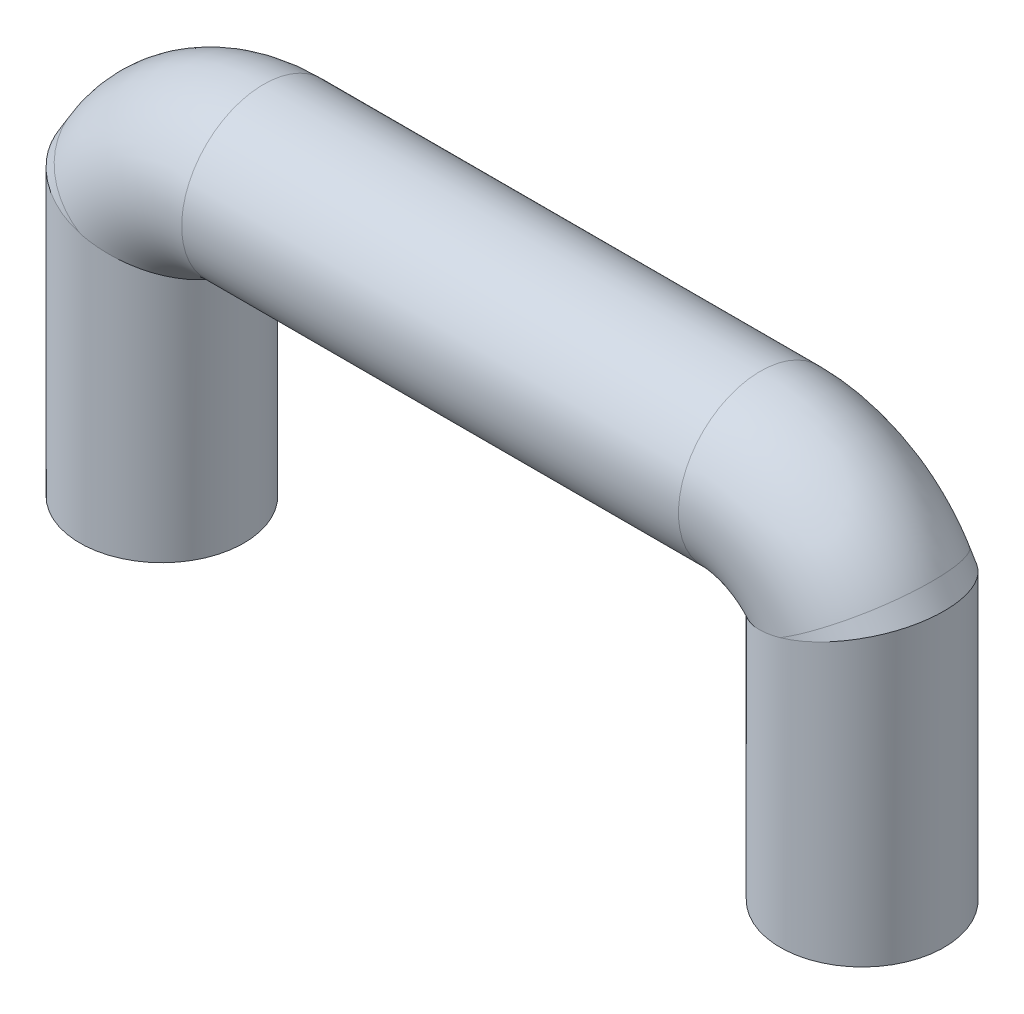
ISO-10303-21;
HEADER;
FILE_DESCRIPTION(('STEP AP214'),'2;1');
FILE_NAME('part.step','',(''),(''),'','','');
FILE_SCHEMA(('AUTOMOTIVE_DESIGN { 1 0 10303 214 1 1 1 1 }'));
ENDSEC;
DATA;
#1=APPLICATION_CONTEXT('core data for automotive mechanical design processes');
#2=APPLICATION_PROTOCOL_DEFINITION('international standard','automotive_design',2000,#1);
#3=PRODUCT_CONTEXT('',#1,'mechanical');
#4=PRODUCT('Part','Part','',(#3));
#5=PRODUCT_RELATED_PRODUCT_CATEGORY('part','',(#4));
#6=PRODUCT_DEFINITION_FORMATION('','',#4);
#7=PRODUCT_DEFINITION_CONTEXT('part definition',#1,'design');
#8=PRODUCT_DEFINITION('design','',#6,#7);
#9=PRODUCT_DEFINITION_SHAPE('','',#8);
#10=(LENGTH_UNIT() NAMED_UNIT(*) SI_UNIT(.MILLI.,.METRE.));
#11=(NAMED_UNIT(*) PLANE_ANGLE_UNIT() SI_UNIT($,.RADIAN.));
#12=(NAMED_UNIT(*) SI_UNIT($,.STERADIAN.) SOLID_ANGLE_UNIT());
#13=UNCERTAINTY_MEASURE_WITH_UNIT(LENGTH_MEASURE(1.E-05),#10,'distance_accuracy_value','');
#14=(GEOMETRIC_REPRESENTATION_CONTEXT(3) GLOBAL_UNCERTAINTY_ASSIGNED_CONTEXT((#13)) GLOBAL_UNIT_ASSIGNED_CONTEXT((#10,
#11,#12)) REPRESENTATION_CONTEXT('',''));
#15=CARTESIAN_POINT('',(0.,0.,0.));
#16=DIRECTION('',(0.,0.,1.));
#17=DIRECTION('',(1.,0.,0.));
#18=AXIS2_PLACEMENT_3D('',#15,#16,#17);
#19=CARTESIAN_POINT('',(-17.6186026200873,-16.369519650655,0.));
#20=DIRECTION('',(0.,1.,0.));
#21=DIRECTION('',(0.,0.,-1.));
#22=AXIS2_PLACEMENT_3D('',#19,#20,#21);
#23=PLANE('',#22);
#24=CARTESIAN_POINT('',(-17.6186026200873,-16.369519650655,0.));
#25=DIRECTION('',(0.,1.,0.));
#26=DIRECTION('',(0.,0.,1.));
#27=AXIS2_PLACEMENT_3D('',#24,#25,#26);
#28=CIRCLE('',#27,2.82085553);
#29=CARTESIAN_POINT('',(-17.6186026200873,-16.369519650655,2.82085553));
#30=VERTEX_POINT('',#29);
#31=EDGE_CURVE('E205',#30,#30,#28,.T.);
#32=ORIENTED_EDGE('',*,*,#31,.T.);
#33=EDGE_LOOP('',(#32));
#34=FACE_BOUND('',#33,.T.);
#35=CARTESIAN_POINT('',(-17.6186026200873,-16.369519650655,0.));
#36=DIRECTION('',(0.,1.,0.));
#37=DIRECTION('',(0.,0.,-1.));
#38=AXIS2_PLACEMENT_3D('',#35,#36,#37);
#39=CIRCLE('',#38,4.125);
#40=CARTESIAN_POINT('',(-17.6186026200873,-16.369519650655,-4.125));
#41=VERTEX_POINT('',#40);
#42=EDGE_CURVE('E50',#41,#41,#39,.T.);
#43=ORIENTED_EDGE('',*,*,#42,.F.);
#44=EDGE_LOOP('',(#43));
#45=FACE_BOUND('',#44,.T.);
#46=ADVANCED_FACE('F47',(#34,#45),#23,.F.);
#47=CARTESIAN_POINT('',(17.6186026200873,-16.369519650655,0.));
#48=DIRECTION('',(0.,-1.,0.));
#49=DIRECTION('',(0.,0.,-1.));
#50=AXIS2_PLACEMENT_3D('',#47,#48,#49);
#51=PLANE('',#50);
#52=CARTESIAN_POINT('',(17.6186026200873,-16.369519650655,0.));
#53=DIRECTION('',(0.,-1.,0.));
#54=DIRECTION('',(0.,0.,-1.));
#55=AXIS2_PLACEMENT_3D('',#52,#53,#54);
#56=CIRCLE('',#55,2.82085552878336);
#57=CARTESIAN_POINT('',(17.6186026200873,-16.369519650655,-2.82085552878336));
#58=VERTEX_POINT('',#57);
#59=EDGE_CURVE('E199',#58,#58,#56,.T.);
#60=ORIENTED_EDGE('',*,*,#59,.F.);
#61=EDGE_LOOP('',(#60));
#62=FACE_BOUND('',#61,.T.);
#63=CARTESIAN_POINT('',(17.6186026200873,-16.369519650655,0.));
#64=DIRECTION('',(0.,-1.,0.));
#65=DIRECTION('',(0.,0.,-1.));
#66=AXIS2_PLACEMENT_3D('',#63,#64,#65);
#67=CIRCLE('',#66,4.125);
#68=CARTESIAN_POINT('',(17.6186026200873,-16.369519650655,-4.125));
#69=VERTEX_POINT('',#68);
#70=EDGE_CURVE('E172',#69,#69,#67,.T.);
#71=ORIENTED_EDGE('',*,*,#70,.T.);
#72=EDGE_LOOP('',(#71));
#73=FACE_BOUND('',#72,.T.);
#74=ADVANCED_FACE('F187',(#62,#73),#51,.T.);
#75=CARTESIAN_POINT('',(-17.6186026200873,-0.214422563276417,0.));
#76=DIRECTION('',(0.,-1.,0.));
#77=DIRECTION('',(1.,0.,0.));
#78=AXIS2_PLACEMENT_3D('',#75,#76,#77);
#79=CYLINDRICAL_SURFACE('',#78,4.125);
#80=CARTESIAN_POINT('',(-17.6186026200873,-2.86951965065504,-4.125));
#81=CARTESIAN_POINT('',(-17.6128968235518,-2.87112613427577,-4.12500001518511));
#82=CARTESIAN_POINT('',(-17.6071912129329,-2.87273380517715,-4.12498817536425));
#83=CARTESIAN_POINT('',(-17.4794190029486,-2.90876407261816,-4.12445766424607));
#84=CARTESIAN_POINT('',(-17.3574623015286,-2.94372410383834,-4.11852700793072));
#85=CARTESIAN_POINT('',(-17.1147496630716,-3.01453967239473,-4.09592886641109));
#86=CARTESIAN_POINT('',(-16.9939946928557,-3.05039586026166,-4.07925335016539));
#87=CARTESIAN_POINT('',(-16.7543334326414,-3.12290187060962,-4.0352857600741));
#88=CARTESIAN_POINT('',(-16.6354322466009,-3.15955338399803,-4.00796842594452));
#89=CARTESIAN_POINT('',(-16.4006428621797,-3.23336648891211,-3.942976559663));
#90=CARTESIAN_POINT('',(-16.2847558712435,-3.2705282760085,-3.90529794479571));
#91=CARTESIAN_POINT('',(-15.9455369494259,-3.38159461080433,-3.77812481046318));
#92=CARTESIAN_POINT('',(-15.7276646239738,-3.45598034738844,-3.67393776836076));
#93=CARTESIAN_POINT('',(-15.3133917273406,-3.60380403675916,-3.42921888424413));
#94=CARTESIAN_POINT('',(-15.1169773685411,-3.67724257108469,-3.28871057785453));
#95=CARTESIAN_POINT('',(-14.7493901569286,-3.82117327471932,-2.97360578390559));
#96=CARTESIAN_POINT('',(-14.5784329563172,-3.89163700604125,-2.79874429441132));
#97=CARTESIAN_POINT('',(-14.2688405463201,-4.02530623529539,-2.41961486625036));
#98=CARTESIAN_POINT('',(-14.1302161712934,-4.0885092966705,-2.21533710750902));
#99=CARTESIAN_POINT('',(-13.9523927352985,-4.17300466652817,-1.89444835598539));
#100=CARTESIAN_POINT('',(-13.8987585135937,-4.19911679025437,-1.7868748486565));
#101=CARTESIAN_POINT('',(-13.800843155311,-4.24769693229892,-1.56678470925341));
#102=CARTESIAN_POINT('',(-13.7565570522542,-4.2701668841541,-1.45427074053258));
#103=CARTESIAN_POINT('',(-13.6778880634209,-4.31072511122053,-1.22517592607922));
#104=CARTESIAN_POINT('',(-13.6434968108956,-4.32881708623008,-1.10859861025656));
#105=CARTESIAN_POINT('',(-13.5850350602011,-4.35993934465224,-0.87222214631851));
#106=CARTESIAN_POINT('',(-13.5609631545917,-4.37297031830439,-0.752423439933808));
#107=CARTESIAN_POINT('',(-13.5253569262034,-4.39238062203634,-0.522612090847803));
#108=CARTESIAN_POINT('',(-13.5128208420264,-4.39928889846613,-0.412798478190806));
#109=CARTESIAN_POINT('',(-13.4966066153212,-4.40824156380489,-0.192323622628078));
#110=CARTESIAN_POINT('',(-13.4929277917471,-4.41028632667532,-0.0816624455490589));
#111=CARTESIAN_POINT('',(-13.4944805147506,-4.40942575167135,0.13954641259957));
#112=CARTESIAN_POINT('',(-13.4997096366412,-4.40652176081657,0.250094116360942));
#113=CARTESIAN_POINT('',(-13.5189976433964,-4.39588874160226,0.470177554052248));
#114=CARTESIAN_POINT('',(-13.5330563606574,-4.38815980483,0.579713307151014));
#115=CARTESIAN_POINT('',(-13.5683861725797,-4.36896030952618,0.788474645258816));
#116=CARTESIAN_POINT('',(-13.5890133065344,-4.35782644382733,0.887840970312597));
#117=CARTESIAN_POINT('',(-13.637394554097,-4.33206093188619,1.08437234287644));
#118=CARTESIAN_POINT('',(-13.6651510823335,-4.3174281007082,1.1815366324302));
#119=CARTESIAN_POINT('',(-13.7587332233055,-4.26887551261055,1.46885715104322));
#120=CARTESIAN_POINT('',(-13.8348933003713,-4.23028912675516,1.65496840128586));
#121=CARTESIAN_POINT('',(-14.0184058331836,-4.14107284385081,2.0247909894453));
#122=CARTESIAN_POINT('',(-14.1275519144452,-4.08979437182865,2.20744528436455));
#123=CARTESIAN_POINT('',(-14.3713486421856,-3.98043050725435,2.55257047140177));
#124=CARTESIAN_POINT('',(-14.5060061310424,-3.92234329013579,2.71503592929804));
#125=CARTESIAN_POINT('',(-14.8124809038865,-3.79598712031622,3.03228779705573));
#126=CARTESIAN_POINT('',(-14.9866882946644,-3.72728410552489,3.18459734480883));
#127=CARTESIAN_POINT('',(-15.3575633820103,-3.5877310373574,3.45780474003969));
#128=CARTESIAN_POINT('',(-15.5542442216624,-3.51687974558674,3.57868406952528));
#129=CARTESIAN_POINT('',(-15.9674437418028,-3.37428076588316,3.78728082663452));
#130=CARTESIAN_POINT('',(-16.1841726707593,-3.30253255134338,3.87458167219847));
#131=CARTESIAN_POINT('',(-16.6293900054862,-3.16078431931182,4.0113841503303));
#132=CARTESIAN_POINT('',(-16.8578577308705,-3.09078152966477,4.06094997809607));
#133=CARTESIAN_POINT('',(-17.2588831125475,-2.97207601384589,4.11284527223674));
#134=CARTESIAN_POINT('',(-17.430083358314,-2.92267615270245,4.12425277156103));
#135=CARTESIAN_POINT('',(-17.6071912281267,-2.8727338006982,4.12498817711629));
#136=CARTESIAN_POINT('',(-17.612896837409,-2.87112613018375,4.12500001678629));
#137=CARTESIAN_POINT('',(-17.6186026200873,-2.86951965065504,4.125));
#138=B_SPLINE_CURVE_WITH_KNOTS('',3,(#80,#81,#82,#83,#84,#85,#86,#87,#88,#89,#90,#91,#92,#93,
#94,#95,#96,#97,#98,#99,#100,#101,#102,#103,#104,#105,#106,#107,#108,#109,#110,#111,#112,#113,
#114,#115,#116,#117,#118,#119,#120,#121,#122,#123,#124,#125,#126,#127,#128,#129,#130,#131,#132,
#133,#134,#135,#136,#137),.UNSPECIFIED.,.F.,.F.,(4,2,2,2,2,2,2,2,2,2,2,2,2,2,2,2,2,2,2,2,2,2,2,
2,2,2,2,2,4),(0.,0.0177833256369088,0.398258975931993,0.779019335917142,1.16068906139759,
1.54250939443769,2.29677632962771,3.05055573121066,3.81039588957597,4.57049029704123,
4.93909706522456,5.30750750392988,5.67560550558406,6.04365328692247,6.37543130893956,
6.70718381931752,7.03884604317264,7.37050197159538,7.67643474571521,7.9824712720326,
8.5941591990063,9.24817048381255,9.90235742901795,10.6233244467794,11.3447152847951,
12.0747874667891,12.8036148499089,13.3378655779384,13.3556489035753),.UNSPECIFIED.);
#139=CARTESIAN_POINT('',(-17.6186026200873,-2.86951965065504,-4.125));
#140=VERTEX_POINT('',#139);
#141=CARTESIAN_POINT('',(-17.6186026200873,-2.86951965065504,4.125));
#142=VERTEX_POINT('',#141);
#143=EDGE_CURVE('E74',#140,#142,#138,.T.);
#144=ORIENTED_EDGE('',*,*,#143,.T.);
#145=CARTESIAN_POINT('',(-17.6186026200873,-2.86951965065504,0.));
#146=DIRECTION('',(-0.271016201839277,-0.962574785842956,0.));
#147=DIRECTION('',(-0.962574785842956,0.271016201839277,0.));
#148=AXIS2_PLACEMENT_3D('',#145,#146,#147);
#149=ELLIPSE('',#148,4.28538131339854,4.125);
#150=EDGE_CURVE('E170',#140,#142,#149,.F.);
#151=ORIENTED_EDGE('',*,*,#150,.F.);
#152=EDGE_LOOP('',(#144,#151));
#153=FACE_BOUND('',#152,.T.);
#154=ORIENTED_EDGE('',*,*,#42,.T.);
#155=EDGE_LOOP('',(#154));
#156=FACE_BOUND('',#155,.T.);
#157=ADVANCED_FACE('F184',(#153,#156),#79,.T.);
#158=CARTESIAN_POINT('',(19.0038908296943,-5.13458413532877,0.));
#159=DIRECTION('',(-0.52174672489083,0.853100436681223,0.));
#160=DIRECTION('',(-0.853100436681223,-0.52174672489083,0.));
#161=AXIS2_PLACEMENT_3D('',#158,#159,#160);
#162=CYLINDRICAL_SURFACE('',#161,4.125);
#163=CARTESIAN_POINT('',(17.6186026200873,-2.86951965065502,0.));
#164=DIRECTION('',(0.52174672489083,-0.853100436681223,0.));
#165=DIRECTION('',(0.,0.,-1.));
#166=AXIS2_PLACEMENT_3D('',#163,#164,#165);
#167=CIRCLE('',#166,4.125);
#168=CARTESIAN_POINT('',(17.6186026200873,-2.86951965065502,-4.125));
#169=VERTEX_POINT('',#168);
#170=CARTESIAN_POINT('',(17.6186026200873,-2.86951965065502,4.125));
#171=VERTEX_POINT('',#170);
#172=EDGE_CURVE('E156',#169,#171,#167,.T.);
#173=ORIENTED_EDGE('',*,*,#172,.T.);
#174=CARTESIAN_POINT('',(17.6186026200873,-2.86951965065502,0.));
#175=DIRECTION('',(-0.271016201839279,0.962574785842955,0.));
#176=DIRECTION('',(0.962574785842955,0.271016201839279,0.));
#177=AXIS2_PLACEMENT_3D('',#174,#175,#176);
#178=ELLIPSE('',#177,4.28538131339854,4.125);
#179=EDGE_CURVE('E57',#169,#171,#178,.F.);
#180=ORIENTED_EDGE('',*,*,#179,.F.);
#181=EDGE_LOOP('',(#173,#180));
#182=FACE_BOUND('',#181,.T.);
#183=ADVANCED_FACE('F186',(#182),#162,.T.);
#184=CARTESIAN_POINT('',(12.5,0.,0.));
#185=DIRECTION('',(-1.,0.,0.));
#186=DIRECTION('',(0.,-1.,0.));
#187=AXIS2_PLACEMENT_3D('',#184,#185,#186);
#188=CYLINDRICAL_SURFACE('',#187,4.125);
#189=CARTESIAN_POINT('',(-12.5,0.,0.));
#190=DIRECTION('',(1.,0.,0.));
#191=DIRECTION('',(0.,0.,-1.));
#192=AXIS2_PLACEMENT_3D('',#189,#190,#191);
#193=CIRCLE('',#192,4.125);
#194=CARTESIAN_POINT('',(-12.5,0.,-4.125));
#195=VERTEX_POINT('',#194);
#196=EDGE_CURVE('E163',#195,#195,#193,.T.);
#197=ORIENTED_EDGE('',*,*,#196,.T.);
#198=EDGE_LOOP('',(#197));
#199=FACE_BOUND('',#198,.T.);
#200=CARTESIAN_POINT('',(12.5,0.,0.));
#201=DIRECTION('',(1.,0.,0.));
#202=DIRECTION('',(0.,0.,-1.));
#203=AXIS2_PLACEMENT_3D('',#200,#201,#202);
#204=CIRCLE('',#203,4.125);
#205=CARTESIAN_POINT('',(12.5,0.,-4.125));
#206=VERTEX_POINT('',#205);
#207=EDGE_CURVE('E159',#206,#206,#204,.T.);
#208=ORIENTED_EDGE('',*,*,#207,.F.);
#209=EDGE_LOOP('',(#208));
#210=FACE_BOUND('',#209,.T.);
#211=ADVANCED_FACE('F304',(#199,#210),#188,.T.);
#212=CARTESIAN_POINT('',(-17.6186026200873,-2.86951965065504,0.));
#213=DIRECTION('',(-0.521746724890827,-0.853100436681225,0.));
#214=DIRECTION('',(0.853100436681225,-0.521746724890827,0.));
#215=AXIS2_PLACEMENT_3D('',#212,#213,#214);
#216=CYLINDRICAL_SURFACE('',#215,4.125);
#217=ORIENTED_EDGE('',*,*,#150,.T.);
#218=CARTESIAN_POINT('',(-17.6186026200873,-2.86951965065504,0.));
#219=DIRECTION('',(0.521746724890827,0.853100436681224,0.));
#220=DIRECTION('',(0.,0.,-1.));
#221=AXIS2_PLACEMENT_3D('',#218,#219,#220);
#222=CIRCLE('',#221,4.125);
#223=EDGE_CURVE('E167',#140,#142,#222,.T.);
#224=ORIENTED_EDGE('',*,*,#223,.F.);
#225=EDGE_LOOP('',(#217,#224));
#226=FACE_BOUND('',#225,.T.);
#227=ADVANCED_FACE('F296',(#226),#216,.T.);
#228=CARTESIAN_POINT('',(12.5,-6.,0.));
#229=DIRECTION('',(0.,0.,1.));
#230=DIRECTION('',(1.,0.,0.));
#231=AXIS2_PLACEMENT_3D('',#228,#229,#230);
#232=TOROIDAL_SURFACE('',#231,6.,4.125);
#233=CARTESIAN_POINT('',(17.6186026200873,-2.86951965065502,-4.125));
#234=CARTESIAN_POINT('',(17.6128968235518,-2.87112613427575,-4.12500001518511));
#235=CARTESIAN_POINT('',(17.6071912129329,-2.87273380517713,-4.12498817536425));
#236=CARTESIAN_POINT('',(17.4794190029485,-2.90876407261814,-4.12445766424607));
#237=CARTESIAN_POINT('',(17.3574623015286,-2.94372410383834,-4.11852700793071));
#238=CARTESIAN_POINT('',(17.1147496630716,-3.01453967239473,-4.09592886641109));
#239=CARTESIAN_POINT('',(16.9939946928557,-3.05039586026164,-4.07925335016539));
#240=CARTESIAN_POINT('',(16.7543334326413,-3.1229018706096,-4.0352857600741));
#241=CARTESIAN_POINT('',(16.6354322466009,-3.15955338399801,-4.00796842594452));
#242=CARTESIAN_POINT('',(16.4006428621797,-3.23336648891209,-3.942976559663));
#243=CARTESIAN_POINT('',(16.2847558712435,-3.27052827600848,-3.90529794479571));
#244=CARTESIAN_POINT('',(15.9455369494259,-3.38159461080431,-3.77812481046318));
#245=CARTESIAN_POINT('',(15.7276646239738,-3.45598034738842,-3.67393776836076));
#246=CARTESIAN_POINT('',(15.3133917273406,-3.60380403675913,-3.42921888424416));
#247=CARTESIAN_POINT('',(15.1169773685412,-3.67724257108466,-3.28871057785456));
#248=CARTESIAN_POINT('',(14.7493901569286,-3.82117327471929,-2.97360578390564));
#249=CARTESIAN_POINT('',(14.5784329563173,-3.89163700604122,-2.79874429441137));
#250=CARTESIAN_POINT('',(14.2688405463201,-4.02530623529536,-2.41961486625042));
#251=CARTESIAN_POINT('',(14.1302161712934,-4.08850929667047,-2.21533710750909));
#252=CARTESIAN_POINT('',(13.9523927352985,-4.17300466652815,-1.89444835598546));
#253=CARTESIAN_POINT('',(13.8987585135937,-4.19911679025435,-1.78687484865656));
#254=CARTESIAN_POINT('',(13.8008431553111,-4.2476969322989,-1.56678470925348));
#255=CARTESIAN_POINT('',(13.7565570522542,-4.27016688415408,-1.45427074053265));
#256=CARTESIAN_POINT('',(13.6778880634209,-4.31072511122051,-1.2251759260793));
#257=CARTESIAN_POINT('',(13.6434968108956,-4.32881708623006,-1.10859861025663));
#258=CARTESIAN_POINT('',(13.5850350602011,-4.35993934465223,-0.872222146318582));
#259=CARTESIAN_POINT('',(13.5609631545917,-4.37297031830437,-0.752423439933879));
#260=CARTESIAN_POINT('',(13.5253569262034,-4.39238062203632,-0.522612090847873));
#261=CARTESIAN_POINT('',(13.5128208420264,-4.39928889846612,-0.412798478190876));
#262=CARTESIAN_POINT('',(13.4966066153212,-4.40824156380488,-0.192323622628146));
#263=CARTESIAN_POINT('',(13.4929277917471,-4.41028632667531,-0.081662445549127));
#264=CARTESIAN_POINT('',(13.4944805147505,-4.40942575167134,0.139546412599503));
#265=CARTESIAN_POINT('',(13.4997096366412,-4.40652176081657,0.250094116360875));
#266=CARTESIAN_POINT('',(13.5189976433964,-4.39588874160225,0.470177554052183));
#267=CARTESIAN_POINT('',(13.5330563606573,-4.38815980483,0.57971330715095));
#268=CARTESIAN_POINT('',(13.5683861725797,-4.36896030952618,0.788474645258753));
#269=CARTESIAN_POINT('',(13.5890133065344,-4.35782644382733,0.887840970312534));
#270=CARTESIAN_POINT('',(13.637394554097,-4.33206093188619,1.08437234287638));
#271=CARTESIAN_POINT('',(13.6651510823335,-4.3174281007082,1.18153663243014));
#272=CARTESIAN_POINT('',(13.7587332233055,-4.26887551261055,1.46885715104316));
#273=CARTESIAN_POINT('',(13.8348933003712,-4.23028912675516,1.6549684012858));
#274=CARTESIAN_POINT('',(14.0184058331835,-4.14107284385081,2.02479098944524));
#275=CARTESIAN_POINT('',(14.1275519144452,-4.08979437182866,2.2074452843645));
#276=CARTESIAN_POINT('',(14.3713486421855,-3.98043050725436,2.55257047140171));
#277=CARTESIAN_POINT('',(14.5060061310423,-3.92234329013579,2.71503592929798));
#278=CARTESIAN_POINT('',(14.8124809038865,-3.79598712031623,3.03228779705569));
#279=CARTESIAN_POINT('',(14.9866882946643,-3.7272841055249,3.18459734480878));
#280=CARTESIAN_POINT('',(15.3575633820102,-3.58773103735741,3.45780474003965));
#281=CARTESIAN_POINT('',(15.5542442216623,-3.51687974558674,3.57868406952524));
#282=CARTESIAN_POINT('',(15.9674437418027,-3.37428076588317,3.78728082663449));
#283=CARTESIAN_POINT('',(16.1841726707592,-3.30253255134341,3.87458167219844));
#284=CARTESIAN_POINT('',(16.6293900054862,-3.16078431931179,4.01138415033029));
#285=CARTESIAN_POINT('',(16.8578577308704,-3.09078152966467,4.06094997809606));
#286=CARTESIAN_POINT('',(17.2588831125474,-2.97207601384596,4.11284527223674));
#287=CARTESIAN_POINT('',(17.430083358314,-2.92267615270268,4.12425277156103));
#288=CARTESIAN_POINT('',(17.6071912281267,-2.87273380069819,4.12498817711629));
#289=CARTESIAN_POINT('',(17.6128968374089,-2.87112613018374,4.12500001678629));
#290=CARTESIAN_POINT('',(17.6186026200873,-2.86951965065502,4.125));
#291=B_SPLINE_CURVE_WITH_KNOTS('',3,(#233,#234,#235,#236,#237,#238,#239,#240,#241,#242,#243,
#244,#245,#246,#247,#248,#249,#250,#251,#252,#253,#254,#255,#256,#257,#258,#259,#260,#261,#262,
#263,#264,#265,#266,#267,#268,#269,#270,#271,#272,#273,#274,#275,#276,#277,#278,#279,#280,#281,
#282,#283,#284,#285,#286,#287,#288,#289,#290),.UNSPECIFIED.,.F.,.F.,(4,2,2,2,2,2,2,2,2,2,2,2,2,
2,2,2,2,2,2,2,2,2,2,2,2,2,2,2,4),(0.,0.017783325636909,0.398258975931998,0.779019335917148,
1.1606890613976,1.54250939443769,2.29677632962767,3.05055573121059,3.81039588957589,
4.57049029704116,4.93909706522449,5.30750750392981,5.67560550558399,6.0436532869224,
6.3754313089395,6.70718381931746,7.03884604317258,7.37050197159532,7.67643474571515,
7.98247127203254,8.59415919900623,9.24817048381249,9.90235742901788,10.6233244467793,
11.344715284795,12.074787466789,12.8036148499088,13.3378655779384,13.3556489035753),.UNSPECIFIED.);
#292=EDGE_CURVE('E11',#169,#171,#291,.T.);
#293=ORIENTED_EDGE('',*,*,#292,.T.);
#294=ORIENTED_EDGE('',*,*,#172,.F.);
#295=EDGE_LOOP('',(#293,#294));
#296=FACE_BOUND('',#295,.T.);
#297=ORIENTED_EDGE('',*,*,#207,.T.);
#298=EDGE_LOOP('',(#297));
#299=FACE_BOUND('',#298,.T.);
#300=ADVANCED_FACE('F289',(#296,#299),#232,.T.);
#301=CARTESIAN_POINT('',(-12.5,-6.,0.));
#302=DIRECTION('',(0.,0.,1.));
#303=DIRECTION('',(1.,0.,0.));
#304=AXIS2_PLACEMENT_3D('',#301,#302,#303);
#305=TOROIDAL_SURFACE('',#304,6.,4.125);
#306=ORIENTED_EDGE('',*,*,#223,.T.);
#307=ORIENTED_EDGE('',*,*,#143,.F.);
#308=EDGE_LOOP('',(#306,#307));
#309=FACE_BOUND('',#308,.T.);
#310=ORIENTED_EDGE('',*,*,#196,.F.);
#311=EDGE_LOOP('',(#310));
#312=FACE_BOUND('',#311,.T.);
#313=ADVANCED_FACE('F146',(#309,#312),#305,.T.);
#314=CARTESIAN_POINT('',(17.6186026200873,-16.369519650655,0.));
#315=DIRECTION('',(0.,1.,0.));
#316=DIRECTION('',(-1.,0.,0.));
#317=AXIS2_PLACEMENT_3D('',#314,#315,#316);
#318=CYLINDRICAL_SURFACE('',#317,4.125);
#319=ORIENTED_EDGE('',*,*,#179,.T.);
#320=ORIENTED_EDGE('',*,*,#292,.F.);
#321=EDGE_LOOP('',(#319,#320));
#322=FACE_BOUND('',#321,.T.);
#323=ORIENTED_EDGE('',*,*,#70,.F.);
#324=EDGE_LOOP('',(#323));
#325=FACE_BOUND('',#324,.T.);
#326=ADVANCED_FACE('F142',(#322,#325),#318,.T.);
#327=CARTESIAN_POINT('',(-17.6186026200873,-0.214422563276417,0.));
#328=DIRECTION('',(0.,-1.,0.));
#329=DIRECTION('',(1.,0.,0.));
#330=AXIS2_PLACEMENT_3D('',#327,#328,#329);
#331=CYLINDRICAL_SURFACE('',#330,2.82085553);
#332=CARTESIAN_POINT('',(-17.6186026200873,-2.86951965065504,2.82085553));
#333=CARTESIAN_POINT('',(-17.6138843664896,-2.87084808181566,2.82085558229666));
#334=CARTESIAN_POINT('',(-17.6091660677652,-2.87217738093974,2.82084374177058));
#335=CARTESIAN_POINT('',(-17.4396116126427,-2.91997721754314,2.81999113562382));
#336=CARTESIAN_POINT('',(-17.2747993209953,-2.96748621948206,2.80465614337617));
#337=CARTESIAN_POINT('',(-16.9502672123382,-3.06332260513341,2.7455221844811));
#338=CARTESIAN_POINT('',(-16.7905636446131,-3.11165197111623,2.70164035562035));
#339=CARTESIAN_POINT('',(-16.4812062552691,-3.20765171217886,2.58664553710164));
#340=CARTESIAN_POINT('',(-16.3315427041487,-3.25532268863162,2.51555937188453));
#341=CARTESIAN_POINT('',(-16.0465302834308,-3.34842841327299,2.34800582743901));
#342=CARTESIAN_POINT('',(-15.9111720499933,-3.3938646137346,2.251555197111));
#343=CARTESIAN_POINT('',(-15.6594923568031,-3.48042460642398,2.03626278642482));
#344=CARTESIAN_POINT('',(-15.5430606430958,-3.52157283341167,1.91756005150041));
#345=CARTESIAN_POINT('',(-15.3320716826432,-3.597776560448,1.66031970801459));
#346=CARTESIAN_POINT('',(-15.2375147581882,-3.63283197072677,1.5217818072622));
#347=CARTESIAN_POINT('',(-15.0759521448026,-3.69378072616762,1.23243731798342));
#348=CARTESIAN_POINT('',(-15.0083023966229,-3.71988587869771,1.08203621110189));
#349=CARTESIAN_POINT('',(-14.9000237261083,-3.7621291170813,0.770516377874937));
#350=CARTESIAN_POINT('',(-14.8593762432497,-3.77827404873766,0.609405097342659));
#351=CARTESIAN_POINT('',(-14.8097029008897,-3.79807327657077,0.298983614966186));
#352=CARTESIAN_POINT('',(-14.7978189793766,-3.80285554528497,0.150197197869954));
#353=CARTESIAN_POINT('',(-14.7976759082983,-3.80291255612512,-0.147370563874379));
#354=CARTESIAN_POINT('',(-14.8094111261781,-3.79818956501021,-0.296151901272516));
#355=CARTESIAN_POINT('',(-14.856002354006,-3.77961886947959,-0.589308582097763));
#356=CARTESIAN_POINT('',(-14.8908392345409,-3.7657787146262,-0.733687467614484));
#357=CARTESIAN_POINT('',(-14.9822816428605,-3.72999335383521,-1.01431214305897));
#358=CARTESIAN_POINT('',(-15.0388922771051,-3.70804624667357,-1.1505560164687));
#359=CARTESIAN_POINT('',(-15.1733098523095,-3.65692078077978,-1.41425517718666));
#360=CARTESIAN_POINT('',(-15.2515252837918,-3.62760415713299,-1.54147474774332));
#361=CARTESIAN_POINT('',(-15.4261805912273,-3.56358042742664,-1.78115511833455));
#362=CARTESIAN_POINT('',(-15.5226227916453,-3.5288726339304,-1.89361403283554));
#363=CARTESIAN_POINT('',(-15.7375497347025,-3.45333415139297,-2.10791017170468));
#364=CARTESIAN_POINT('',(-15.857026293132,-3.41225800171518,-2.2086664861182));
#365=CARTESIAN_POINT('',(-16.1103401349207,-3.32736944220127,-2.38883912566824));
#366=CARTESIAN_POINT('',(-16.2441875721346,-3.28355510693623,-2.46824022141938));
#367=CARTESIAN_POINT('',(-16.5296646444156,-3.19241899526866,-2.60727499620736));
#368=CARTESIAN_POINT('',(-16.6818473394798,-3.14503110549228,-2.66573072416842));
#369=CARTESIAN_POINT('',(-16.9937390624611,-3.05031542697241,-2.75554684250044));
#370=CARTESIAN_POINT('',(-17.1534334429436,-3.00298769214542,-2.78695783292373));
#371=CARTESIAN_POINT('',(-17.4108897299522,-2.9284315918803,-2.81486333226251));
#372=CARTESIAN_POINT('',(-17.5076300099472,-2.90080168751707,-2.82033414364641));
#373=CARTESIAN_POINT('',(-17.6091659004851,-2.87217743622274,-2.82084369332411));
#374=CARTESIAN_POINT('',(-17.6138841964038,-2.87084813816648,-2.82085553257628));
#375=CARTESIAN_POINT('',(-17.6186026200873,-2.86951965065504,-2.82085553));
#376=B_SPLINE_CURVE_WITH_KNOTS('',3,(#332,#333,#334,#335,#336,#337,#338,#339,#340,#341,#342,
#343,#344,#345,#346,#347,#348,#349,#350,#351,#352,#353,#354,#355,#356,#357,#358,#359,#360,#361,
#362,#363,#364,#365,#366,#367,#368,#369,#370,#371,#372,#373,#374,#375),.UNSPECIFIED.,.F.,.F.,(4,
2,2,2,2,2,2,2,2,2,2,2,2,2,2,2,2,2,2,2,2,4),(0.,0.014705907314422,0.528466421719377,
1.04372491074599,1.55847664024702,2.0728893138678,2.58418872868735,3.09549567621216,
3.59369703320577,4.09155558664532,4.53744209540285,4.983222284336,5.42863380357266,
5.87414984609367,6.32874604100341,6.78340024985878,7.26605896131855,7.74906097159972,
8.25605740016645,8.76210317642181,9.0638750116578,9.07858091897223),.UNSPECIFIED.);
#377=CARTESIAN_POINT('',(-17.6186026200873,-2.86951965065504,-2.82085553));
#378=VERTEX_POINT('',#377);
#379=CARTESIAN_POINT('',(-17.6186026200873,-2.86951965065504,2.82085553));
#380=VERTEX_POINT('',#379);
#381=EDGE_CURVE('E98',#378,#380,#376,.F.);
#382=ORIENTED_EDGE('',*,*,#381,.F.);
#383=CARTESIAN_POINT('',(-17.6186026200873,-2.86951965065504,0.));
#384=DIRECTION('',(-0.271016201839277,-0.962574785842956,0.));
#385=DIRECTION('',(-0.962574785842956,0.271016201839277,0.));
#386=AXIS2_PLACEMENT_3D('',#383,#384,#385);
#387=ELLIPSE('',#386,2.9305312911658,2.82085553);
#388=EDGE_CURVE('E94',#378,#380,#387,.F.);
#389=ORIENTED_EDGE('',*,*,#388,.T.);
#390=EDGE_LOOP('',(#382,#389));
#391=FACE_BOUND('',#390,.T.);
#392=ORIENTED_EDGE('',*,*,#31,.F.);
#393=EDGE_LOOP('',(#392));
#394=FACE_BOUND('',#393,.T.);
#395=ADVANCED_FACE('F96',(#391,#394),#331,.F.);
#396=CARTESIAN_POINT('',(19.0038908296943,-5.13458413532877,0.));
#397=DIRECTION('',(-0.52174672489083,0.853100436681223,0.));
#398=DIRECTION('',(-0.853100436681223,-0.52174672489083,0.));
#399=AXIS2_PLACEMENT_3D('',#396,#397,#398);
#400=CYLINDRICAL_SURFACE('',#399,2.82085553);
#401=CARTESIAN_POINT('',(17.6186026200873,-2.86951965065502,0.));
#402=DIRECTION('',(-0.52174672489083,0.853100436681223,0.));
#403=DIRECTION('',(-0.853100436681223,-0.52174672489083,0.));
#404=AXIS2_PLACEMENT_3D('',#401,#402,#403);
#405=CIRCLE('',#404,2.82085553);
#406=CARTESIAN_POINT('',(17.6186026200873,-2.86951965065502,-2.82085553));
#407=VERTEX_POINT('',#406);
#408=CARTESIAN_POINT('',(17.6186026200873,-2.86951965065502,2.82085553));
#409=VERTEX_POINT('',#408);
#410=EDGE_CURVE('E208',#407,#409,#405,.F.);
#411=ORIENTED_EDGE('',*,*,#410,.F.);
#412=CARTESIAN_POINT('',(17.6186026200873,-2.86951965065502,0.));
#413=DIRECTION('',(-0.271016201839279,0.962574785842955,0.));
#414=DIRECTION('',(0.962574785842955,0.271016201839279,0.));
#415=AXIS2_PLACEMENT_3D('',#412,#413,#414);
#416=ELLIPSE('',#415,2.9305312911658,2.82085553);
#417=EDGE_CURVE('E83',#407,#409,#416,.F.);
#418=ORIENTED_EDGE('',*,*,#417,.T.);
#419=EDGE_LOOP('',(#411,#418));
#420=FACE_BOUND('',#419,.T.);
#421=ADVANCED_FACE('F133',(#420),#400,.F.);
#422=CARTESIAN_POINT('',(12.5,0.,0.));
#423=DIRECTION('',(-1.,0.,0.));
#424=DIRECTION('',(0.,-1.,0.));
#425=AXIS2_PLACEMENT_3D('',#422,#423,#424);
#426=CYLINDRICAL_SURFACE('',#425,2.82085553);
#427=CARTESIAN_POINT('',(-12.5,0.,0.));
#428=DIRECTION('',(-1.,0.,0.));
#429=DIRECTION('',(0.,-1.,0.));
#430=AXIS2_PLACEMENT_3D('',#427,#428,#429);
#431=CIRCLE('',#430,2.82085553);
#432=CARTESIAN_POINT('',(-12.5,-2.82085553,0.));
#433=VERTEX_POINT('',#432);
#434=EDGE_CURVE('E112',#433,#433,#431,.F.);
#435=ORIENTED_EDGE('',*,*,#434,.F.);
#436=EDGE_LOOP('',(#435));
#437=FACE_BOUND('',#436,.T.);
#438=CARTESIAN_POINT('',(12.5,0.,0.));
#439=DIRECTION('',(1.,0.,0.));
#440=DIRECTION('',(0.,1.,0.));
#441=AXIS2_PLACEMENT_3D('',#438,#439,#440);
#442=CIRCLE('',#441,2.82085553);
#443=CARTESIAN_POINT('',(12.5,2.82085553,0.));
#444=VERTEX_POINT('',#443);
#445=EDGE_CURVE('E116',#444,#444,#442,.T.);
#446=ORIENTED_EDGE('',*,*,#445,.T.);
#447=EDGE_LOOP('',(#446));
#448=FACE_BOUND('',#447,.T.);
#449=ADVANCED_FACE('F136',(#437,#448),#426,.F.);
#450=CARTESIAN_POINT('',(-17.6186026200873,-2.86951965065504,0.));
#451=DIRECTION('',(-0.521746724890827,-0.853100436681225,0.));
#452=DIRECTION('',(0.853100436681225,-0.521746724890827,0.));
#453=AXIS2_PLACEMENT_3D('',#450,#451,#452);
#454=CYLINDRICAL_SURFACE('',#453,2.82085553);
#455=ORIENTED_EDGE('',*,*,#388,.F.);
#456=CARTESIAN_POINT('',(-17.6186026200873,-2.86951965065504,0.));
#457=DIRECTION('',(0.521746724890827,0.853100436681224,0.));
#458=DIRECTION('',(-0.853100436681224,0.521746724890827,0.));
#459=AXIS2_PLACEMENT_3D('',#456,#457,#458);
#460=CIRCLE('',#459,2.82085553);
#461=EDGE_CURVE('E107',#378,#380,#460,.T.);
#462=ORIENTED_EDGE('',*,*,#461,.T.);
#463=EDGE_LOOP('',(#455,#462));
#464=FACE_BOUND('',#463,.T.);
#465=ADVANCED_FACE('F110',(#464),#454,.F.);
#466=CARTESIAN_POINT('',(12.5,-6.,0.));
#467=DIRECTION('',(0.,0.,1.));
#468=DIRECTION('',(1.,0.,0.));
#469=AXIS2_PLACEMENT_3D('',#466,#467,#468);
#470=TOROIDAL_SURFACE('',#469,6.,2.82085553);
#471=CARTESIAN_POINT('',(17.6186026200873,-2.86951965065502,2.82085553));
#472=CARTESIAN_POINT('',(17.6138843664896,-2.87084808181563,2.82085558229666));
#473=CARTESIAN_POINT('',(17.6091660677652,-2.8721773809397,2.82084374177058));
#474=CARTESIAN_POINT('',(17.4396116126426,-2.91997721754291,2.81999113562382));
#475=CARTESIAN_POINT('',(17.2747993209952,-2.96748621948201,2.80465614337617));
#476=CARTESIAN_POINT('',(16.9502672123381,-3.06332260513349,2.74552218448107));
#477=CARTESIAN_POINT('',(16.7905636446129,-3.11165197111628,2.7016403556203));
#478=CARTESIAN_POINT('',(16.4812062552688,-3.20765171217889,2.58664553710154));
#479=CARTESIAN_POINT('',(16.3315427041485,-3.25532268863168,2.51555937188441));
#480=CARTESIAN_POINT('',(16.0465302834305,-3.34842841327308,2.34800582743882));
#481=CARTESIAN_POINT('',(15.9111720499929,-3.3938646137347,2.25155519711076));
#482=CARTESIAN_POINT('',(15.6594923568028,-3.48042460642407,2.03626278642452));
#483=CARTESIAN_POINT('',(15.5430606430955,-3.52157283341176,1.91756005150009));
#484=CARTESIAN_POINT('',(15.3320716826429,-3.59777656044808,1.66031970801424));
#485=CARTESIAN_POINT('',(15.237514758188,-3.63283197072684,1.52178180726183));
#486=CARTESIAN_POINT('',(15.0759521448025,-3.69378072616766,1.23243731798308));
#487=CARTESIAN_POINT('',(15.0083023966228,-3.71988587869773,1.08203621110161));
#488=CARTESIAN_POINT('',(14.9000237261082,-3.7621291170813,0.770516377874769));
#489=CARTESIAN_POINT('',(14.8593762432497,-3.77827404873765,0.609405097342553));
#490=CARTESIAN_POINT('',(14.8097029008897,-3.79807327657076,0.298983614966144));
#491=CARTESIAN_POINT('',(14.7978189793765,-3.80285554528496,0.150197197869913));
#492=CARTESIAN_POINT('',(14.7976759082983,-3.8029125561251,-0.14737056387442));
#493=CARTESIAN_POINT('',(14.8094111261781,-3.79818956501019,-0.296151901272557));
#494=CARTESIAN_POINT('',(14.856002354006,-3.77961886947958,-0.589308582097804));
#495=CARTESIAN_POINT('',(14.8908392345409,-3.76577871462618,-0.733687467614524));
#496=CARTESIAN_POINT('',(14.9822816428605,-3.72999335383519,-1.01431214305901));
#497=CARTESIAN_POINT('',(15.0388922771051,-3.70804624667355,-1.15055601646874));
#498=CARTESIAN_POINT('',(15.1733098523095,-3.65692078077976,-1.41425517718669));
#499=CARTESIAN_POINT('',(15.2515252837918,-3.62760415713296,-1.54147474774336));
#500=CARTESIAN_POINT('',(15.4261805912273,-3.56358042742662,-1.78115511833458));
#501=CARTESIAN_POINT('',(15.5226227916453,-3.52887263393037,-1.89361403283558));
#502=CARTESIAN_POINT('',(15.7375497347025,-3.45333415139294,-2.10791017170471));
#503=CARTESIAN_POINT('',(15.8570262931321,-3.41225800171515,-2.20866648611822));
#504=CARTESIAN_POINT('',(16.1103401349207,-3.32736944220124,-2.38883912566826));
#505=CARTESIAN_POINT('',(16.2441875721347,-3.2835551069362,-2.4682402214194));
#506=CARTESIAN_POINT('',(16.5296646444156,-3.19241899526863,-2.60727499620738));
#507=CARTESIAN_POINT('',(16.6818473394799,-3.14503110549225,-2.66573072416844));
#508=CARTESIAN_POINT('',(16.9937390624611,-3.05031542697239,-2.75554684250045));
#509=CARTESIAN_POINT('',(17.1534334429436,-3.00298769214541,-2.78695783292374));
#510=CARTESIAN_POINT('',(17.4108897299522,-2.92843159188025,-2.81486333226251));
#511=CARTESIAN_POINT('',(17.5076300099472,-2.90080168751699,-2.82033414364641));
#512=CARTESIAN_POINT('',(17.6091659004851,-2.87217743622272,-2.82084369332411));
#513=CARTESIAN_POINT('',(17.6138841964037,-2.87084813816646,-2.82085553257628));
#514=CARTESIAN_POINT('',(17.6186026200873,-2.86951965065502,-2.82085553));
#515=B_SPLINE_CURVE_WITH_KNOTS('',3,(#471,#472,#473,#474,#475,#476,#477,#478,#479,#480,#481,
#482,#483,#484,#485,#486,#487,#488,#489,#490,#491,#492,#493,#494,#495,#496,#497,#498,#499,#500,
#501,#502,#503,#504,#505,#506,#507,#508,#509,#510,#511,#512,#513,#514),.UNSPECIFIED.,.F.,.F.,(4,
2,2,2,2,2,2,2,2,2,2,2,2,2,2,2,2,2,2,2,2,4),(0.,0.0147059073144239,0.528466421719485,
1.0437249107462,1.55847664024735,2.07288931386824,2.58418872868779,3.0954956762126,
3.59369703320601,4.09155558664536,4.53744209540289,4.98322228433604,5.4286338035727,
5.87414984609371,6.32874604100346,6.78340024985882,7.2660589613186,7.74906097159977,
8.2560574001665,8.76210317642186,9.06387501165781,9.07858091897223),.UNSPECIFIED.);
#516=EDGE_CURVE('E218',#407,#409,#515,.F.);
#517=ORIENTED_EDGE('',*,*,#516,.F.);
#518=ORIENTED_EDGE('',*,*,#410,.T.);
#519=EDGE_LOOP('',(#517,#518));
#520=FACE_BOUND('',#519,.T.);
#521=ORIENTED_EDGE('',*,*,#445,.F.);
#522=EDGE_LOOP('',(#521));
#523=FACE_BOUND('',#522,.T.);
#524=ADVANCED_FACE('F132',(#520,#523),#470,.F.);
#525=CARTESIAN_POINT('',(-12.5,-6.,0.));
#526=DIRECTION('',(0.,0.,1.));
#527=DIRECTION('',(1.,0.,0.));
#528=AXIS2_PLACEMENT_3D('',#525,#526,#527);
#529=TOROIDAL_SURFACE('',#528,6.,2.82085553);
#530=ORIENTED_EDGE('',*,*,#461,.F.);
#531=ORIENTED_EDGE('',*,*,#381,.T.);
#532=EDGE_LOOP('',(#530,#531));
#533=FACE_BOUND('',#532,.T.);
#534=ORIENTED_EDGE('',*,*,#434,.T.);
#535=EDGE_LOOP('',(#534));
#536=FACE_BOUND('',#535,.T.);
#537=ADVANCED_FACE('F105',(#533,#536),#529,.F.);
#538=CARTESIAN_POINT('',(17.6186026200873,-16.369519650655,0.));
#539=DIRECTION('',(0.,1.,0.));
#540=DIRECTION('',(-1.,0.,0.));
#541=AXIS2_PLACEMENT_3D('',#538,#539,#540);
#542=CYLINDRICAL_SURFACE('',#541,2.82085553);
#543=ORIENTED_EDGE('',*,*,#417,.F.);
#544=ORIENTED_EDGE('',*,*,#516,.T.);
#545=EDGE_LOOP('',(#543,#544));
#546=FACE_BOUND('',#545,.T.);
#547=ORIENTED_EDGE('',*,*,#59,.T.);
#548=EDGE_LOOP('',(#547));
#549=FACE_BOUND('',#548,.T.);
#550=ADVANCED_FACE('F131',(#546,#549),#542,.F.);
#551=CLOSED_SHELL('',(#46,#74,#157,#183,#211,#227,#300,#313,#326,#395,#421,#449,#465,#524,#537,#550));
#552=MANIFOLD_SOLID_BREP('B2',#551);
#553=ADVANCED_BREP_SHAPE_REPRESENTATION('',(#18,#552),#14);
#554=SHAPE_DEFINITION_REPRESENTATION(#9,#553);
ENDSEC;
END-ISO-10303-21;
